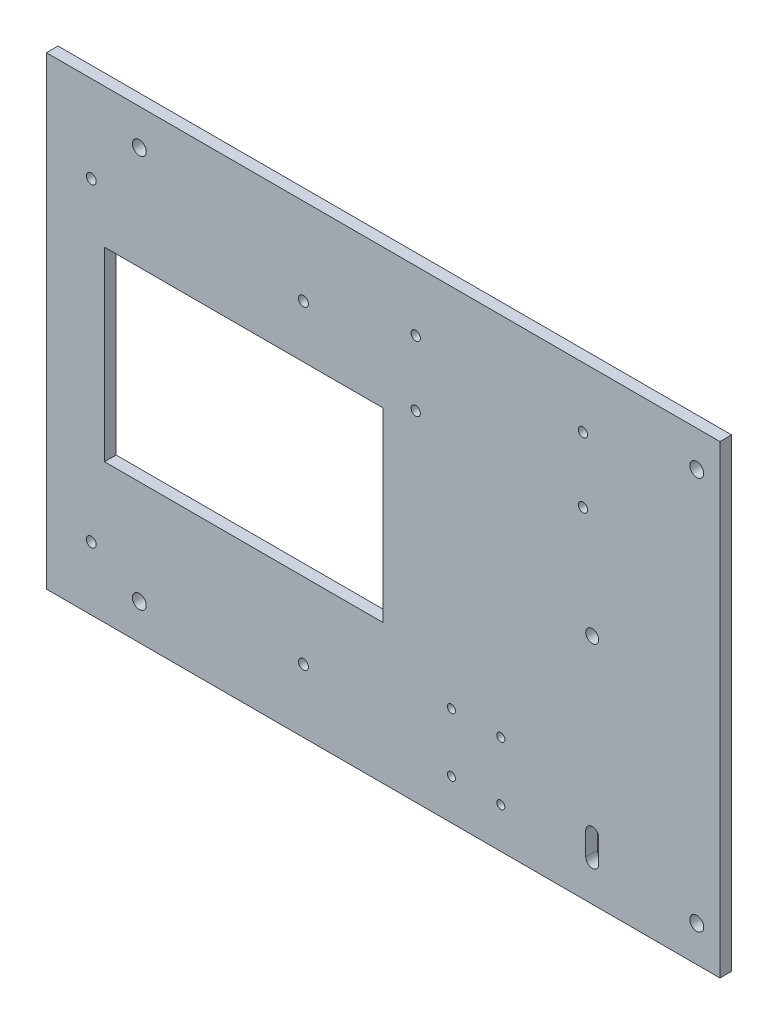
ISO-10303-21;
HEADER;
FILE_DESCRIPTION(('STEP AP214'),'2;1');
FILE_NAME('part.step','',(''),(''),'','','');
FILE_SCHEMA(('AUTOMOTIVE_DESIGN { 1 0 10303 214 1 1 1 1 }'));
ENDSEC;
DATA;
#1=APPLICATION_CONTEXT('core data for automotive mechanical design processes');
#2=APPLICATION_PROTOCOL_DEFINITION('international standard','automotive_design',2000,#1);
#3=PRODUCT_CONTEXT('',#1,'mechanical');
#4=PRODUCT('Part','Part','',(#3));
#5=PRODUCT_RELATED_PRODUCT_CATEGORY('part','',(#4));
#6=PRODUCT_DEFINITION_FORMATION('','',#4);
#7=PRODUCT_DEFINITION_CONTEXT('part definition',#1,'design');
#8=PRODUCT_DEFINITION('design','',#6,#7);
#9=PRODUCT_DEFINITION_SHAPE('','',#8);
#10=(LENGTH_UNIT() NAMED_UNIT(*) SI_UNIT(.MILLI.,.METRE.));
#11=(NAMED_UNIT(*) PLANE_ANGLE_UNIT() SI_UNIT($,.RADIAN.));
#12=(NAMED_UNIT(*) SI_UNIT($,.STERADIAN.) SOLID_ANGLE_UNIT());
#13=UNCERTAINTY_MEASURE_WITH_UNIT(LENGTH_MEASURE(1.E-05),#10,'distance_accuracy_value','');
#14=(GEOMETRIC_REPRESENTATION_CONTEXT(3) GLOBAL_UNCERTAINTY_ASSIGNED_CONTEXT((#13)) GLOBAL_UNIT_ASSIGNED_CONTEXT((#10,
#11,#12)) REPRESENTATION_CONTEXT('',''));
#15=CARTESIAN_POINT('',(0.,0.,0.));
#16=DIRECTION('',(0.,0.,1.));
#17=DIRECTION('',(1.,0.,0.));
#18=AXIS2_PLACEMENT_3D('',#15,#16,#17);
#19=CARTESIAN_POINT('',(92.075,63.5,3.175));
#20=DIRECTION('',(-1.,0.,0.));
#21=DIRECTION('',(0.,-1.,0.));
#22=AXIS2_PLACEMENT_3D('',#19,#20,#21);
#23=PLANE('',#22);
#24=DIRECTION('',(0.,1.,0.));
#25=VECTOR('',#24,1.);
#26=CARTESIAN_POINT('',(92.075,63.5,0.));
#27=LINE('',#26,#25);
#28=CARTESIAN_POINT('',(92.075,-63.5,0.));
#29=VERTEX_POINT('',#28);
#30=CARTESIAN_POINT('',(92.075,63.5,0.));
#31=VERTEX_POINT('',#30);
#32=EDGE_CURVE('E296',#29,#31,#27,.T.);
#33=ORIENTED_EDGE('',*,*,#32,.T.);
#34=DIRECTION('',(0.,0.,-1.));
#35=VECTOR('',#34,1.);
#36=CARTESIAN_POINT('',(92.075,63.5,3.175));
#37=LINE('',#36,#35);
#38=CARTESIAN_POINT('',(92.075,63.5,3.175));
#39=VERTEX_POINT('',#38);
#40=EDGE_CURVE('E11',#39,#31,#37,.T.);
#41=ORIENTED_EDGE('',*,*,#40,.F.);
#42=DIRECTION('',(0.,1.,0.));
#43=VECTOR('',#42,1.);
#44=CARTESIAN_POINT('',(92.075,63.5,3.175));
#45=LINE('',#44,#43);
#46=CARTESIAN_POINT('',(92.075,-63.5,3.175));
#47=VERTEX_POINT('',#46);
#48=EDGE_CURVE('E299',#47,#39,#45,.T.);
#49=ORIENTED_EDGE('',*,*,#48,.F.);
#50=DIRECTION('',(0.,0.,-1.));
#51=VECTOR('',#50,1.);
#52=CARTESIAN_POINT('',(92.075,-63.5,3.175));
#53=LINE('',#52,#51);
#54=EDGE_CURVE('E309',#47,#29,#53,.T.);
#55=ORIENTED_EDGE('',*,*,#54,.T.);
#56=EDGE_LOOP('',(#33,#41,#49,#55));
#57=FACE_BOUND('',#56,.T.);
#58=ADVANCED_FACE('F40',(#57),#23,.F.);
#59=CARTESIAN_POINT('',(-92.075,63.5,3.175));
#60=DIRECTION('',(0.,-1.,0.));
#61=DIRECTION('',(0.,0.,-1.));
#62=AXIS2_PLACEMENT_3D('',#59,#60,#61);
#63=PLANE('',#62);
#64=DIRECTION('',(-1.,0.,0.));
#65=VECTOR('',#64,1.);
#66=CARTESIAN_POINT('',(-92.075,63.5,0.));
#67=LINE('',#66,#65);
#68=CARTESIAN_POINT('',(-92.075,63.5,0.));
#69=VERTEX_POINT('',#68);
#70=EDGE_CURVE('E312',#31,#69,#67,.T.);
#71=ORIENTED_EDGE('',*,*,#70,.T.);
#72=DIRECTION('',(0.,0.,-1.));
#73=VECTOR('',#72,1.);
#74=CARTESIAN_POINT('',(-92.075,63.5,3.175));
#75=LINE('',#74,#73);
#76=CARTESIAN_POINT('',(-92.075,63.5,3.175));
#77=VERTEX_POINT('',#76);
#78=EDGE_CURVE('E47',#77,#69,#75,.T.);
#79=ORIENTED_EDGE('',*,*,#78,.F.);
#80=DIRECTION('',(-1.,0.,0.));
#81=VECTOR('',#80,1.);
#82=CARTESIAN_POINT('',(-92.075,63.5,3.175));
#83=LINE('',#82,#81);
#84=EDGE_CURVE('E302',#39,#77,#83,.T.);
#85=ORIENTED_EDGE('',*,*,#84,.F.);
#86=ORIENTED_EDGE('',*,*,#40,.T.);
#87=EDGE_LOOP('',(#71,#79,#85,#86));
#88=FACE_BOUND('',#87,.T.);
#89=ADVANCED_FACE('F341',(#88),#63,.F.);
#90=CARTESIAN_POINT('',(-92.075,63.5,3.175));
#91=DIRECTION('',(1.,0.,0.));
#92=DIRECTION('',(0.,1.,0.));
#93=AXIS2_PLACEMENT_3D('',#90,#91,#92);
#94=PLANE('',#93);
#95=DIRECTION('',(0.,-1.,0.));
#96=VECTOR('',#95,1.);
#97=CARTESIAN_POINT('',(-92.075,63.5,0.));
#98=LINE('',#97,#96);
#99=CARTESIAN_POINT('',(-92.075,-63.5,0.));
#100=VERTEX_POINT('',#99);
#101=EDGE_CURVE('E314',#69,#100,#98,.T.);
#102=ORIENTED_EDGE('',*,*,#101,.T.);
#103=DIRECTION('',(0.,0.,-1.));
#104=VECTOR('',#103,1.);
#105=CARTESIAN_POINT('',(-92.075,-63.5,3.175));
#106=LINE('',#105,#104);
#107=CARTESIAN_POINT('',(-92.075,-63.5,3.175));
#108=VERTEX_POINT('',#107);
#109=EDGE_CURVE('E319',#108,#100,#106,.T.);
#110=ORIENTED_EDGE('',*,*,#109,.F.);
#111=DIRECTION('',(0.,-1.,0.));
#112=VECTOR('',#111,1.);
#113=CARTESIAN_POINT('',(-92.075,63.5,3.175));
#114=LINE('',#113,#112);
#115=EDGE_CURVE('E305',#77,#108,#114,.T.);
#116=ORIENTED_EDGE('',*,*,#115,.F.);
#117=ORIENTED_EDGE('',*,*,#78,.T.);
#118=EDGE_LOOP('',(#102,#110,#116,#117));
#119=FACE_BOUND('',#118,.T.);
#120=ADVANCED_FACE('F326',(#119),#94,.F.);
#121=CARTESIAN_POINT('',(-92.075,-63.5,3.175));
#122=DIRECTION('',(0.,1.,0.));
#123=DIRECTION('',(0.,0.,1.));
#124=AXIS2_PLACEMENT_3D('',#121,#122,#123);
#125=PLANE('',#124);
#126=DIRECTION('',(1.,0.,0.));
#127=VECTOR('',#126,1.);
#128=CARTESIAN_POINT('',(-92.075,-63.5,0.));
#129=LINE('',#128,#127);
#130=EDGE_CURVE('E303',#100,#29,#129,.T.);
#131=ORIENTED_EDGE('',*,*,#130,.T.);
#132=ORIENTED_EDGE('',*,*,#54,.F.);
#133=DIRECTION('',(1.,0.,0.));
#134=VECTOR('',#133,1.);
#135=CARTESIAN_POINT('',(-92.075,-63.5,3.175));
#136=LINE('',#135,#134);
#137=EDGE_CURVE('E307',#108,#47,#136,.T.);
#138=ORIENTED_EDGE('',*,*,#137,.F.);
#139=ORIENTED_EDGE('',*,*,#109,.T.);
#140=EDGE_LOOP('',(#131,#132,#138,#139));
#141=FACE_BOUND('',#140,.T.);
#142=ADVANCED_FACE('F334',(#141),#125,.F.);
#143=CARTESIAN_POINT('',(0.,0.,3.175));
#144=DIRECTION('',(0.,0.,1.));
#145=DIRECTION('',(1.,0.,0.));
#146=AXIS2_PLACEMENT_3D('',#143,#144,#145);
#147=PLANE('',#146);
#148=DIRECTION('',(0.,1.,0.));
#149=VECTOR('',#148,1.);
#150=CARTESIAN_POINT('',(0.,25.4,3.175));
#151=LINE('',#150,#149);
#152=CARTESIAN_POINT('',(0.,-25.4,3.175));
#153=VERTEX_POINT('',#152);
#154=CARTESIAN_POINT('',(0.,25.4,3.175));
#155=VERTEX_POINT('',#154);
#156=EDGE_CURVE('E54',#153,#155,#151,.T.);
#157=ORIENTED_EDGE('',*,*,#156,.F.);
#158=DIRECTION('',(1.,0.,0.));
#159=VECTOR('',#158,1.);
#160=CARTESIAN_POINT('',(-76.2,-25.4,3.175));
#161=LINE('',#160,#159);
#162=CARTESIAN_POINT('',(-76.2,-25.4,3.175));
#163=VERTEX_POINT('',#162);
#164=EDGE_CURVE('E146',#163,#153,#161,.T.);
#165=ORIENTED_EDGE('',*,*,#164,.F.);
#166=DIRECTION('',(0.,-1.,0.));
#167=VECTOR('',#166,1.);
#168=CARTESIAN_POINT('',(-76.2,25.4,3.175));
#169=LINE('',#168,#167);
#170=CARTESIAN_POINT('',(-76.2,25.4,3.175));
#171=VERTEX_POINT('',#170);
#172=EDGE_CURVE('E149',#171,#163,#169,.T.);
#173=ORIENTED_EDGE('',*,*,#172,.F.);
#174=DIRECTION('',(-1.,0.,0.));
#175=VECTOR('',#174,1.);
#176=CARTESIAN_POINT('',(-76.2,25.4,3.175));
#177=LINE('',#176,#175);
#178=EDGE_CURVE('E155',#155,#171,#177,.T.);
#179=ORIENTED_EDGE('',*,*,#178,.F.);
#180=EDGE_LOOP('',(#157,#165,#173,#179));
#181=FACE_BOUND('',#180,.T.);
#182=CARTESIAN_POINT('',(57.15,0.,3.175));
#183=DIRECTION('',(0.,0.,1.));
#184=DIRECTION('',(1.,0.,0.));
#185=AXIS2_PLACEMENT_3D('',#182,#183,#184);
#186=CIRCLE('',#185,1.77800000000001);
#187=CARTESIAN_POINT('',(58.928,0.,3.175));
#188=VERTEX_POINT('',#187);
#189=EDGE_CURVE('E169',#188,#188,#186,.T.);
#190=ORIENTED_EDGE('',*,*,#189,.F.);
#191=EDGE_LOOP('',(#190));
#192=FACE_BOUND('',#191,.T.);
#193=CARTESIAN_POINT('',(57.15,-46.863,3.175));
#194=DIRECTION('',(0.,0.,1.));
#195=DIRECTION('',(1.,0.,0.));
#196=AXIS2_PLACEMENT_3D('',#193,#194,#195);
#197=CIRCLE('',#196,1.77800000000001);
#198=CARTESIAN_POINT('',(58.928,-46.863,3.175));
#199=VERTEX_POINT('',#198);
#200=CARTESIAN_POINT('',(55.372,-46.863,3.175));
#201=VERTEX_POINT('',#200);
#202=EDGE_CURVE('E161',#199,#201,#197,.T.);
#203=ORIENTED_EDGE('',*,*,#202,.F.);
#204=DIRECTION('',(0.,1.,0.));
#205=VECTOR('',#204,1.);
#206=CARTESIAN_POINT('',(58.928,-46.863,3.175));
#207=LINE('',#206,#205);
#208=CARTESIAN_POINT('',(58.928,-53.213,3.175));
#209=VERTEX_POINT('',#208);
#210=EDGE_CURVE('E177',#209,#199,#207,.T.);
#211=ORIENTED_EDGE('',*,*,#210,.F.);
#212=CARTESIAN_POINT('',(57.15,-53.213,3.175));
#213=DIRECTION('',(0.,0.,1.));
#214=DIRECTION('',(1.,0.,0.));
#215=AXIS2_PLACEMENT_3D('',#212,#213,#214);
#216=CIRCLE('',#215,1.77800000000001);
#217=CARTESIAN_POINT('',(55.372,-53.213,3.175));
#218=VERTEX_POINT('',#217);
#219=EDGE_CURVE('E191',#218,#209,#216,.T.);
#220=ORIENTED_EDGE('',*,*,#219,.F.);
#221=DIRECTION('',(0.,-1.,0.));
#222=VECTOR('',#221,1.);
#223=CARTESIAN_POINT('',(55.372,-46.863,3.175));
#224=LINE('',#223,#222);
#225=EDGE_CURVE('E188',#201,#218,#224,.T.);
#226=ORIENTED_EDGE('',*,*,#225,.F.);
#227=EDGE_LOOP('',(#203,#211,#220,#226));
#228=FACE_BOUND('',#227,.T.);
#229=CARTESIAN_POINT('',(8.89,46.99,3.175));
#230=DIRECTION('',(0.,0.,1.));
#231=DIRECTION('',(1.,0.,0.));
#232=AXIS2_PLACEMENT_3D('',#229,#230,#231);
#233=CIRCLE('',#232,1.27);
#234=CARTESIAN_POINT('',(10.16,46.99,3.175));
#235=VERTEX_POINT('',#234);
#236=EDGE_CURVE('E168',#235,#235,#233,.T.);
#237=ORIENTED_EDGE('',*,*,#236,.F.);
#238=EDGE_LOOP('',(#237));
#239=FACE_BOUND('',#238,.T.);
#240=CARTESIAN_POINT('',(8.89,29.21,3.175));
#241=DIRECTION('',(0.,0.,1.));
#242=DIRECTION('',(1.,0.,0.));
#243=AXIS2_PLACEMENT_3D('',#240,#241,#242);
#244=CIRCLE('',#243,1.27);
#245=CARTESIAN_POINT('',(10.16,29.21,3.175));
#246=VERTEX_POINT('',#245);
#247=EDGE_CURVE('E213',#246,#246,#244,.T.);
#248=ORIENTED_EDGE('',*,*,#247,.F.);
#249=EDGE_LOOP('',(#248));
#250=FACE_BOUND('',#249,.T.);
#251=CARTESIAN_POINT('',(54.61,29.21,3.175));
#252=DIRECTION('',(0.,0.,1.));
#253=DIRECTION('',(1.,0.,0.));
#254=AXIS2_PLACEMENT_3D('',#251,#252,#253);
#255=CIRCLE('',#254,1.27);
#256=CARTESIAN_POINT('',(55.88,29.21,3.175));
#257=VERTEX_POINT('',#256);
#258=EDGE_CURVE('E207',#257,#257,#255,.T.);
#259=ORIENTED_EDGE('',*,*,#258,.F.);
#260=EDGE_LOOP('',(#259));
#261=FACE_BOUND('',#260,.T.);
#262=CARTESIAN_POINT('',(54.61,46.99,3.175));
#263=DIRECTION('',(0.,0.,1.));
#264=DIRECTION('',(1.,0.,0.));
#265=AXIS2_PLACEMENT_3D('',#262,#263,#264);
#266=CIRCLE('',#265,1.27);
#267=CARTESIAN_POINT('',(55.88,46.99,3.175));
#268=VERTEX_POINT('',#267);
#269=EDGE_CURVE('E206',#268,#268,#266,.T.);
#270=ORIENTED_EDGE('',*,*,#269,.F.);
#271=EDGE_LOOP('',(#270));
#272=FACE_BOUND('',#271,.T.);
#273=CARTESIAN_POINT('',(18.650000038,-52.45,3.175));
#274=DIRECTION('',(0.,0.,1.));
#275=DIRECTION('',(1.,0.,0.));
#276=AXIS2_PLACEMENT_3D('',#273,#274,#275);
#277=CIRCLE('',#276,1.0999978);
#278=CARTESIAN_POINT('',(19.749997838,-52.45,3.175));
#279=VERTEX_POINT('',#278);
#280=EDGE_CURVE('E224',#279,#279,#277,.T.);
#281=ORIENTED_EDGE('',*,*,#280,.F.);
#282=EDGE_LOOP('',(#281));
#283=FACE_BOUND('',#282,.T.);
#284=CARTESIAN_POINT('',(32.149999962,-52.45,3.175));
#285=DIRECTION('',(0.,0.,1.));
#286=DIRECTION('',(1.,0.,0.));
#287=AXIS2_PLACEMENT_3D('',#284,#285,#286);
#288=CIRCLE('',#287,1.0999978);
#289=CARTESIAN_POINT('',(33.249997762,-52.45,3.175));
#290=VERTEX_POINT('',#289);
#291=EDGE_CURVE('E237',#290,#290,#288,.T.);
#292=ORIENTED_EDGE('',*,*,#291,.F.);
#293=EDGE_LOOP('',(#292));
#294=FACE_BOUND('',#293,.T.);
#295=CARTESIAN_POINT('',(32.149999962,-36.45,3.175));
#296=DIRECTION('',(0.,0.,1.));
#297=DIRECTION('',(1.,0.,0.));
#298=AXIS2_PLACEMENT_3D('',#295,#296,#297);
#299=CIRCLE('',#298,1.0999978);
#300=CARTESIAN_POINT('',(33.249997762,-36.45,3.175));
#301=VERTEX_POINT('',#300);
#302=EDGE_CURVE('E231',#301,#301,#299,.T.);
#303=ORIENTED_EDGE('',*,*,#302,.F.);
#304=EDGE_LOOP('',(#303));
#305=FACE_BOUND('',#304,.T.);
#306=CARTESIAN_POINT('',(18.650000038,-36.45,3.175));
#307=DIRECTION('',(0.,0.,1.));
#308=DIRECTION('',(1.,0.,0.));
#309=AXIS2_PLACEMENT_3D('',#306,#307,#308);
#310=CIRCLE('',#309,1.0999978);
#311=CARTESIAN_POINT('',(19.749997838,-36.45,3.175));
#312=VERTEX_POINT('',#311);
#313=EDGE_CURVE('E230',#312,#312,#310,.T.);
#314=ORIENTED_EDGE('',*,*,#313,.F.);
#315=EDGE_LOOP('',(#314));
#316=FACE_BOUND('',#315,.T.);
#317=CARTESIAN_POINT('',(-66.675,-53.721,3.175));
#318=DIRECTION('',(0.,0.,1.));
#319=DIRECTION('',(1.,0.,0.));
#320=AXIS2_PLACEMENT_3D('',#317,#318,#319);
#321=CIRCLE('',#320,1.89865);
#322=CARTESIAN_POINT('',(-64.77635,-53.721,3.175));
#323=VERTEX_POINT('',#322);
#324=EDGE_CURVE('E248',#323,#323,#321,.T.);
#325=ORIENTED_EDGE('',*,*,#324,.F.);
#326=EDGE_LOOP('',(#325));
#327=FACE_BOUND('',#326,.T.);
#328=CARTESIAN_POINT('',(85.725,-53.721,3.175));
#329=DIRECTION('',(0.,0.,1.));
#330=DIRECTION('',(1.,0.,0.));
#331=AXIS2_PLACEMENT_3D('',#328,#329,#330);
#332=CIRCLE('',#331,1.89865);
#333=CARTESIAN_POINT('',(87.62365,-53.721,3.175));
#334=VERTEX_POINT('',#333);
#335=EDGE_CURVE('E256',#334,#334,#332,.T.);
#336=ORIENTED_EDGE('',*,*,#335,.F.);
#337=EDGE_LOOP('',(#336));
#338=FACE_BOUND('',#337,.T.);
#339=CARTESIAN_POINT('',(-66.675,53.721,3.175));
#340=DIRECTION('',(0.,0.,1.));
#341=DIRECTION('',(1.,0.,0.));
#342=AXIS2_PLACEMENT_3D('',#339,#340,#341);
#343=CIRCLE('',#342,1.89865);
#344=CARTESIAN_POINT('',(-64.77635,53.721,3.175));
#345=VERTEX_POINT('',#344);
#346=EDGE_CURVE('E262',#345,#345,#343,.T.);
#347=ORIENTED_EDGE('',*,*,#346,.F.);
#348=EDGE_LOOP('',(#347));
#349=FACE_BOUND('',#348,.T.);
#350=CARTESIAN_POINT('',(85.725,53.721,3.175));
#351=DIRECTION('',(0.,0.,1.));
#352=DIRECTION('',(1.,0.,0.));
#353=AXIS2_PLACEMENT_3D('',#350,#351,#352);
#354=CIRCLE('',#353,1.89865);
#355=CARTESIAN_POINT('',(87.62365,53.721,3.175));
#356=VERTEX_POINT('',#355);
#357=EDGE_CURVE('E268',#356,#356,#354,.T.);
#358=ORIENTED_EDGE('',*,*,#357,.F.);
#359=EDGE_LOOP('',(#358));
#360=FACE_BOUND('',#359,.T.);
#361=CARTESIAN_POINT('',(-21.799999961,-46.175,3.175));
#362=DIRECTION('',(0.,0.,1.));
#363=DIRECTION('',(1.,0.,0.));
#364=AXIS2_PLACEMENT_3D('',#361,#362,#363);
#365=CIRCLE('',#364,1.35);
#366=CARTESIAN_POINT('',(-20.449999961,-46.175,3.175));
#367=VERTEX_POINT('',#366);
#368=EDGE_CURVE('E274',#367,#367,#365,.T.);
#369=ORIENTED_EDGE('',*,*,#368,.F.);
#370=EDGE_LOOP('',(#369));
#371=FACE_BOUND('',#370,.T.);
#372=CARTESIAN_POINT('',(-79.800000039,-46.175,3.175));
#373=DIRECTION('',(0.,0.,1.));
#374=DIRECTION('',(1.,0.,0.));
#375=AXIS2_PLACEMENT_3D('',#372,#373,#374);
#376=CIRCLE('',#375,1.35000000000001);
#377=CARTESIAN_POINT('',(-78.450000039,-46.175,3.175));
#378=VERTEX_POINT('',#377);
#379=EDGE_CURVE('E285',#378,#378,#376,.T.);
#380=ORIENTED_EDGE('',*,*,#379,.F.);
#381=EDGE_LOOP('',(#380));
#382=FACE_BOUND('',#381,.T.);
#383=CARTESIAN_POINT('',(-79.800000039,39.825,3.175));
#384=DIRECTION('',(0.,0.,1.));
#385=DIRECTION('',(1.,0.,0.));
#386=AXIS2_PLACEMENT_3D('',#383,#384,#385);
#387=CIRCLE('',#386,1.35000000000001);
#388=CARTESIAN_POINT('',(-78.450000039,39.825,3.175));
#389=VERTEX_POINT('',#388);
#390=EDGE_CURVE('E279',#389,#389,#387,.T.);
#391=ORIENTED_EDGE('',*,*,#390,.F.);
#392=EDGE_LOOP('',(#391));
#393=FACE_BOUND('',#392,.T.);
#394=CARTESIAN_POINT('',(-21.799999961,39.825,3.175));
#395=DIRECTION('',(0.,0.,1.));
#396=DIRECTION('',(1.,0.,0.));
#397=AXIS2_PLACEMENT_3D('',#394,#395,#396);
#398=CIRCLE('',#397,1.35);
#399=CARTESIAN_POINT('',(-20.449999961,39.825,3.175));
#400=VERTEX_POINT('',#399);
#401=EDGE_CURVE('E278',#400,#400,#398,.T.);
#402=ORIENTED_EDGE('',*,*,#401,.F.);
#403=EDGE_LOOP('',(#402));
#404=FACE_BOUND('',#403,.T.);
#405=ORIENTED_EDGE('',*,*,#48,.T.);
#406=ORIENTED_EDGE('',*,*,#84,.T.);
#407=ORIENTED_EDGE('',*,*,#115,.T.);
#408=ORIENTED_EDGE('',*,*,#137,.T.);
#409=EDGE_LOOP('',(#405,#406,#407,#408));
#410=FACE_BOUND('',#409,.T.);
#411=ADVANCED_FACE('F340',(#181,#192,#228,#239,#250,#261,#272,#283,#294,#305,#316,#327,#338,
#349,#360,#371,#382,#393,#404,#410),#147,.T.);
#412=CARTESIAN_POINT('',(0.,0.,0.));
#413=DIRECTION('',(0.,0.,1.));
#414=DIRECTION('',(1.,0.,0.));
#415=AXIS2_PLACEMENT_3D('',#412,#413,#414);
#416=PLANE('',#415);
#417=DIRECTION('',(1.,0.,0.));
#418=VECTOR('',#417,1.);
#419=CARTESIAN_POINT('',(-76.2,-25.4,0.));
#420=LINE('',#419,#418);
#421=CARTESIAN_POINT('',(-76.2,-25.4,0.));
#422=VERTEX_POINT('',#421);
#423=CARTESIAN_POINT('',(0.,-25.4,0.));
#424=VERTEX_POINT('',#423);
#425=EDGE_CURVE('E136',#422,#424,#420,.T.);
#426=ORIENTED_EDGE('',*,*,#425,.T.);
#427=DIRECTION('',(0.,1.,0.));
#428=VECTOR('',#427,1.);
#429=CARTESIAN_POINT('',(0.,25.4,0.));
#430=LINE('',#429,#428);
#431=CARTESIAN_POINT('',(0.,25.4,0.));
#432=VERTEX_POINT('',#431);
#433=EDGE_CURVE('E130',#424,#432,#430,.T.);
#434=ORIENTED_EDGE('',*,*,#433,.T.);
#435=DIRECTION('',(-1.,0.,0.));
#436=VECTOR('',#435,1.);
#437=CARTESIAN_POINT('',(-76.2,25.4,0.));
#438=LINE('',#437,#436);
#439=CARTESIAN_POINT('',(-76.2,25.4,0.));
#440=VERTEX_POINT('',#439);
#441=EDGE_CURVE('E139',#432,#440,#438,.T.);
#442=ORIENTED_EDGE('',*,*,#441,.T.);
#443=DIRECTION('',(0.,-1.,0.));
#444=VECTOR('',#443,1.);
#445=CARTESIAN_POINT('',(-76.2,25.4,0.));
#446=LINE('',#445,#444);
#447=EDGE_CURVE('E62',#440,#422,#446,.T.);
#448=ORIENTED_EDGE('',*,*,#447,.T.);
#449=EDGE_LOOP('',(#426,#434,#442,#448));
#450=FACE_BOUND('',#449,.T.);
#451=CARTESIAN_POINT('',(57.15,0.,0.));
#452=DIRECTION('',(0.,0.,1.));
#453=DIRECTION('',(1.,0.,0.));
#454=AXIS2_PLACEMENT_3D('',#451,#452,#453);
#455=CIRCLE('',#454,1.77800000000001);
#456=CARTESIAN_POINT('',(58.928,0.,0.));
#457=VERTEX_POINT('',#456);
#458=EDGE_CURVE('E165',#457,#457,#455,.T.);
#459=ORIENTED_EDGE('',*,*,#458,.T.);
#460=EDGE_LOOP('',(#459));
#461=FACE_BOUND('',#460,.T.);
#462=DIRECTION('',(0.,1.,0.));
#463=VECTOR('',#462,1.);
#464=CARTESIAN_POINT('',(58.928,-46.863,0.));
#465=LINE('',#464,#463);
#466=CARTESIAN_POINT('',(58.928,-53.213,0.));
#467=VERTEX_POINT('',#466);
#468=CARTESIAN_POINT('',(58.928,-46.863,0.));
#469=VERTEX_POINT('',#468);
#470=EDGE_CURVE('E183',#467,#469,#465,.T.);
#471=ORIENTED_EDGE('',*,*,#470,.T.);
#472=CARTESIAN_POINT('',(57.15,-46.863,0.));
#473=DIRECTION('',(0.,0.,1.));
#474=DIRECTION('',(1.,0.,0.));
#475=AXIS2_PLACEMENT_3D('',#472,#473,#474);
#476=CIRCLE('',#475,1.77800000000001);
#477=CARTESIAN_POINT('',(55.372,-46.863,0.));
#478=VERTEX_POINT('',#477);
#479=EDGE_CURVE('E173',#469,#478,#476,.T.);
#480=ORIENTED_EDGE('',*,*,#479,.T.);
#481=DIRECTION('',(0.,-1.,0.));
#482=VECTOR('',#481,1.);
#483=CARTESIAN_POINT('',(55.372,-46.863,0.));
#484=LINE('',#483,#482);
#485=CARTESIAN_POINT('',(55.372,-53.213,0.));
#486=VERTEX_POINT('',#485);
#487=EDGE_CURVE('E176',#478,#486,#484,.T.);
#488=ORIENTED_EDGE('',*,*,#487,.T.);
#489=CARTESIAN_POINT('',(57.15,-53.213,0.));
#490=DIRECTION('',(0.,0.,1.));
#491=DIRECTION('',(1.,0.,0.));
#492=AXIS2_PLACEMENT_3D('',#489,#490,#491);
#493=CIRCLE('',#492,1.77800000000001);
#494=EDGE_CURVE('E180',#486,#467,#493,.T.);
#495=ORIENTED_EDGE('',*,*,#494,.T.);
#496=EDGE_LOOP('',(#471,#480,#488,#495));
#497=FACE_BOUND('',#496,.T.);
#498=CARTESIAN_POINT('',(8.89,46.99,0.));
#499=DIRECTION('',(0.,0.,1.));
#500=DIRECTION('',(1.,0.,0.));
#501=AXIS2_PLACEMENT_3D('',#498,#499,#500);
#502=CIRCLE('',#501,1.27);
#503=CARTESIAN_POINT('',(10.16,46.99,0.));
#504=VERTEX_POINT('',#503);
#505=EDGE_CURVE('E216',#504,#504,#502,.T.);
#506=ORIENTED_EDGE('',*,*,#505,.T.);
#507=EDGE_LOOP('',(#506));
#508=FACE_BOUND('',#507,.T.);
#509=CARTESIAN_POINT('',(8.89,29.21,0.));
#510=DIRECTION('',(0.,0.,1.));
#511=DIRECTION('',(1.,0.,0.));
#512=AXIS2_PLACEMENT_3D('',#509,#510,#511);
#513=CIRCLE('',#512,1.27);
#514=CARTESIAN_POINT('',(10.16,29.21,0.));
#515=VERTEX_POINT('',#514);
#516=EDGE_CURVE('E210',#515,#515,#513,.T.);
#517=ORIENTED_EDGE('',*,*,#516,.T.);
#518=EDGE_LOOP('',(#517));
#519=FACE_BOUND('',#518,.T.);
#520=CARTESIAN_POINT('',(54.61,29.21,0.));
#521=DIRECTION('',(0.,0.,1.));
#522=DIRECTION('',(1.,0.,0.));
#523=AXIS2_PLACEMENT_3D('',#520,#521,#522);
#524=CIRCLE('',#523,1.27);
#525=CARTESIAN_POINT('',(55.88,29.21,0.));
#526=VERTEX_POINT('',#525);
#527=EDGE_CURVE('E203',#526,#526,#524,.T.);
#528=ORIENTED_EDGE('',*,*,#527,.T.);
#529=EDGE_LOOP('',(#528));
#530=FACE_BOUND('',#529,.T.);
#531=CARTESIAN_POINT('',(54.61,46.99,0.));
#532=DIRECTION('',(0.,0.,1.));
#533=DIRECTION('',(1.,0.,0.));
#534=AXIS2_PLACEMENT_3D('',#531,#532,#533);
#535=CIRCLE('',#534,1.27);
#536=CARTESIAN_POINT('',(55.88,46.99,0.));
#537=VERTEX_POINT('',#536);
#538=EDGE_CURVE('E221',#537,#537,#535,.T.);
#539=ORIENTED_EDGE('',*,*,#538,.T.);
#540=EDGE_LOOP('',(#539));
#541=FACE_BOUND('',#540,.T.);
#542=CARTESIAN_POINT('',(18.650000038,-52.45,0.));
#543=DIRECTION('',(0.,0.,1.));
#544=DIRECTION('',(1.,0.,0.));
#545=AXIS2_PLACEMENT_3D('',#542,#543,#544);
#546=CIRCLE('',#545,1.0999978);
#547=CARTESIAN_POINT('',(19.749997838,-52.45,0.));
#548=VERTEX_POINT('',#547);
#549=EDGE_CURVE('E240',#548,#548,#546,.T.);
#550=ORIENTED_EDGE('',*,*,#549,.T.);
#551=EDGE_LOOP('',(#550));
#552=FACE_BOUND('',#551,.T.);
#553=CARTESIAN_POINT('',(32.149999962,-52.45,0.));
#554=DIRECTION('',(0.,0.,1.));
#555=DIRECTION('',(1.,0.,0.));
#556=AXIS2_PLACEMENT_3D('',#553,#554,#555);
#557=CIRCLE('',#556,1.0999978);
#558=CARTESIAN_POINT('',(33.249997762,-52.45,0.));
#559=VERTEX_POINT('',#558);
#560=EDGE_CURVE('E234',#559,#559,#557,.T.);
#561=ORIENTED_EDGE('',*,*,#560,.T.);
#562=EDGE_LOOP('',(#561));
#563=FACE_BOUND('',#562,.T.);
#564=CARTESIAN_POINT('',(32.149999962,-36.45,0.));
#565=DIRECTION('',(0.,0.,1.));
#566=DIRECTION('',(1.,0.,0.));
#567=AXIS2_PLACEMENT_3D('',#564,#565,#566);
#568=CIRCLE('',#567,1.0999978);
#569=CARTESIAN_POINT('',(33.249997762,-36.45,0.));
#570=VERTEX_POINT('',#569);
#571=EDGE_CURVE('E227',#570,#570,#568,.T.);
#572=ORIENTED_EDGE('',*,*,#571,.T.);
#573=EDGE_LOOP('',(#572));
#574=FACE_BOUND('',#573,.T.);
#575=CARTESIAN_POINT('',(18.650000038,-36.45,0.));
#576=DIRECTION('',(0.,0.,1.));
#577=DIRECTION('',(1.,0.,0.));
#578=AXIS2_PLACEMENT_3D('',#575,#576,#577);
#579=CIRCLE('',#578,1.0999978);
#580=CARTESIAN_POINT('',(19.749997838,-36.45,0.));
#581=VERTEX_POINT('',#580);
#582=EDGE_CURVE('E245',#581,#581,#579,.T.);
#583=ORIENTED_EDGE('',*,*,#582,.T.);
#584=EDGE_LOOP('',(#583));
#585=FACE_BOUND('',#584,.T.);
#586=CARTESIAN_POINT('',(-66.675,-53.721,0.));
#587=DIRECTION('',(0.,0.,1.));
#588=DIRECTION('',(1.,0.,0.));
#589=AXIS2_PLACEMENT_3D('',#586,#587,#588);
#590=CIRCLE('',#589,1.89865);
#591=CARTESIAN_POINT('',(-64.77635,-53.721,0.));
#592=VERTEX_POINT('',#591);
#593=EDGE_CURVE('E253',#592,#592,#590,.T.);
#594=ORIENTED_EDGE('',*,*,#593,.T.);
#595=EDGE_LOOP('',(#594));
#596=FACE_BOUND('',#595,.T.);
#597=CARTESIAN_POINT('',(85.725,-53.721,0.));
#598=DIRECTION('',(0.,0.,1.));
#599=DIRECTION('',(1.,0.,0.));
#600=AXIS2_PLACEMENT_3D('',#597,#598,#599);
#601=CIRCLE('',#600,1.89865);
#602=CARTESIAN_POINT('',(87.62365,-53.721,0.));
#603=VERTEX_POINT('',#602);
#604=EDGE_CURVE('E259',#603,#603,#601,.T.);
#605=ORIENTED_EDGE('',*,*,#604,.T.);
#606=EDGE_LOOP('',(#605));
#607=FACE_BOUND('',#606,.T.);
#608=CARTESIAN_POINT('',(-66.675,53.721,0.));
#609=DIRECTION('',(0.,0.,1.));
#610=DIRECTION('',(1.,0.,0.));
#611=AXIS2_PLACEMENT_3D('',#608,#609,#610);
#612=CIRCLE('',#611,1.89865);
#613=CARTESIAN_POINT('',(-64.77635,53.721,0.));
#614=VERTEX_POINT('',#613);
#615=EDGE_CURVE('E265',#614,#614,#612,.T.);
#616=ORIENTED_EDGE('',*,*,#615,.T.);
#617=EDGE_LOOP('',(#616));
#618=FACE_BOUND('',#617,.T.);
#619=CARTESIAN_POINT('',(85.725,53.721,0.));
#620=DIRECTION('',(0.,0.,1.));
#621=DIRECTION('',(1.,0.,0.));
#622=AXIS2_PLACEMENT_3D('',#619,#620,#621);
#623=CIRCLE('',#622,1.89865);
#624=CARTESIAN_POINT('',(87.62365,53.721,0.));
#625=VERTEX_POINT('',#624);
#626=EDGE_CURVE('E271',#625,#625,#623,.T.);
#627=ORIENTED_EDGE('',*,*,#626,.T.);
#628=EDGE_LOOP('',(#627));
#629=FACE_BOUND('',#628,.T.);
#630=CARTESIAN_POINT('',(-21.799999961,-46.175,0.));
#631=DIRECTION('',(0.,0.,1.));
#632=DIRECTION('',(1.,0.,0.));
#633=AXIS2_PLACEMENT_3D('',#630,#631,#632);
#634=CIRCLE('',#633,1.35);
#635=CARTESIAN_POINT('',(-20.449999961,-46.175,0.));
#636=VERTEX_POINT('',#635);
#637=EDGE_CURVE('E288',#636,#636,#634,.T.);
#638=ORIENTED_EDGE('',*,*,#637,.T.);
#639=EDGE_LOOP('',(#638));
#640=FACE_BOUND('',#639,.T.);
#641=CARTESIAN_POINT('',(-79.800000039,-46.175,0.));
#642=DIRECTION('',(0.,0.,1.));
#643=DIRECTION('',(1.,0.,0.));
#644=AXIS2_PLACEMENT_3D('',#641,#642,#643);
#645=CIRCLE('',#644,1.35000000000001);
#646=CARTESIAN_POINT('',(-78.450000039,-46.175,0.));
#647=VERTEX_POINT('',#646);
#648=EDGE_CURVE('E282',#647,#647,#645,.T.);
#649=ORIENTED_EDGE('',*,*,#648,.T.);
#650=EDGE_LOOP('',(#649));
#651=FACE_BOUND('',#650,.T.);
#652=CARTESIAN_POINT('',(-79.800000039,39.825,0.));
#653=DIRECTION('',(0.,0.,1.));
#654=DIRECTION('',(1.,0.,0.));
#655=AXIS2_PLACEMENT_3D('',#652,#653,#654);
#656=CIRCLE('',#655,1.35000000000001);
#657=CARTESIAN_POINT('',(-78.450000039,39.825,0.));
#658=VERTEX_POINT('',#657);
#659=EDGE_CURVE('E275',#658,#658,#656,.T.);
#660=ORIENTED_EDGE('',*,*,#659,.T.);
#661=EDGE_LOOP('',(#660));
#662=FACE_BOUND('',#661,.T.);
#663=CARTESIAN_POINT('',(-21.799999961,39.825,0.));
#664=DIRECTION('',(0.,0.,1.));
#665=DIRECTION('',(1.,0.,0.));
#666=AXIS2_PLACEMENT_3D('',#663,#664,#665);
#667=CIRCLE('',#666,1.35);
#668=CARTESIAN_POINT('',(-20.449999961,39.825,0.));
#669=VERTEX_POINT('',#668);
#670=EDGE_CURVE('E293',#669,#669,#667,.T.);
#671=ORIENTED_EDGE('',*,*,#670,.T.);
#672=EDGE_LOOP('',(#671));
#673=FACE_BOUND('',#672,.T.);
#674=ORIENTED_EDGE('',*,*,#32,.F.);
#675=ORIENTED_EDGE('',*,*,#130,.F.);
#676=ORIENTED_EDGE('',*,*,#101,.F.);
#677=ORIENTED_EDGE('',*,*,#70,.F.);
#678=EDGE_LOOP('',(#674,#675,#676,#677));
#679=FACE_BOUND('',#678,.T.);
#680=ADVANCED_FACE('F143',(#450,#461,#497,#508,#519,#530,#541,#552,#563,#574,#585,#596,#607,
#618,#629,#640,#651,#662,#673,#679),#416,.F.);
#681=CARTESIAN_POINT('',(-21.799999961,39.825,0.));
#682=DIRECTION('',(0.,0.,1.));
#683=DIRECTION('',(1.,0.,0.));
#684=AXIS2_PLACEMENT_3D('',#681,#682,#683);
#685=CYLINDRICAL_SURFACE('',#684,1.35);
#686=ORIENTED_EDGE('',*,*,#670,.F.);
#687=EDGE_LOOP('',(#686));
#688=FACE_BOUND('',#687,.T.);
#689=ORIENTED_EDGE('',*,*,#401,.T.);
#690=EDGE_LOOP('',(#689));
#691=FACE_BOUND('',#690,.T.);
#692=ADVANCED_FACE('F353',(#688,#691),#685,.F.);
#693=CARTESIAN_POINT('',(-79.800000039,39.825,0.));
#694=DIRECTION('',(0.,0.,1.));
#695=DIRECTION('',(1.,0.,0.));
#696=AXIS2_PLACEMENT_3D('',#693,#694,#695);
#697=CYLINDRICAL_SURFACE('',#696,1.35000000000001);
#698=ORIENTED_EDGE('',*,*,#659,.F.);
#699=EDGE_LOOP('',(#698));
#700=FACE_BOUND('',#699,.T.);
#701=ORIENTED_EDGE('',*,*,#390,.T.);
#702=EDGE_LOOP('',(#701));
#703=FACE_BOUND('',#702,.T.);
#704=ADVANCED_FACE('F359',(#700,#703),#697,.F.);
#705=CARTESIAN_POINT('',(-79.800000039,-46.175,0.));
#706=DIRECTION('',(0.,0.,1.));
#707=DIRECTION('',(1.,0.,0.));
#708=AXIS2_PLACEMENT_3D('',#705,#706,#707);
#709=CYLINDRICAL_SURFACE('',#708,1.35000000000001);
#710=ORIENTED_EDGE('',*,*,#648,.F.);
#711=EDGE_LOOP('',(#710));
#712=FACE_BOUND('',#711,.T.);
#713=ORIENTED_EDGE('',*,*,#379,.T.);
#714=EDGE_LOOP('',(#713));
#715=FACE_BOUND('',#714,.T.);
#716=ADVANCED_FACE('F365',(#712,#715),#709,.F.);
#717=CARTESIAN_POINT('',(-21.799999961,-46.175,0.));
#718=DIRECTION('',(0.,0.,1.));
#719=DIRECTION('',(1.,0.,0.));
#720=AXIS2_PLACEMENT_3D('',#717,#718,#719);
#721=CYLINDRICAL_SURFACE('',#720,1.35);
#722=ORIENTED_EDGE('',*,*,#637,.F.);
#723=EDGE_LOOP('',(#722));
#724=FACE_BOUND('',#723,.T.);
#725=ORIENTED_EDGE('',*,*,#368,.T.);
#726=EDGE_LOOP('',(#725));
#727=FACE_BOUND('',#726,.T.);
#728=ADVANCED_FACE('F361',(#724,#727),#721,.F.);
#729=CARTESIAN_POINT('',(85.725,53.721,3.175));
#730=DIRECTION('',(0.,0.,1.));
#731=DIRECTION('',(1.,0.,0.));
#732=AXIS2_PLACEMENT_3D('',#729,#730,#731);
#733=CYLINDRICAL_SURFACE('',#732,1.89865);
#734=ORIENTED_EDGE('',*,*,#626,.F.);
#735=EDGE_LOOP('',(#734));
#736=FACE_BOUND('',#735,.T.);
#737=ORIENTED_EDGE('',*,*,#357,.T.);
#738=EDGE_LOOP('',(#737));
#739=FACE_BOUND('',#738,.T.);
#740=ADVANCED_FACE('F364',(#736,#739),#733,.F.);
#741=CARTESIAN_POINT('',(-66.675,53.721,3.175));
#742=DIRECTION('',(0.,0.,1.));
#743=DIRECTION('',(1.,0.,0.));
#744=AXIS2_PLACEMENT_3D('',#741,#742,#743);
#745=CYLINDRICAL_SURFACE('',#744,1.89865);
#746=ORIENTED_EDGE('',*,*,#615,.F.);
#747=EDGE_LOOP('',(#746));
#748=FACE_BOUND('',#747,.T.);
#749=ORIENTED_EDGE('',*,*,#346,.T.);
#750=EDGE_LOOP('',(#749));
#751=FACE_BOUND('',#750,.T.);
#752=ADVANCED_FACE('F375',(#748,#751),#745,.F.);
#753=CARTESIAN_POINT('',(85.725,-53.721,3.175));
#754=DIRECTION('',(0.,0.,1.));
#755=DIRECTION('',(1.,0.,0.));
#756=AXIS2_PLACEMENT_3D('',#753,#754,#755);
#757=CYLINDRICAL_SURFACE('',#756,1.89865);
#758=ORIENTED_EDGE('',*,*,#604,.F.);
#759=EDGE_LOOP('',(#758));
#760=FACE_BOUND('',#759,.T.);
#761=ORIENTED_EDGE('',*,*,#335,.T.);
#762=EDGE_LOOP('',(#761));
#763=FACE_BOUND('',#762,.T.);
#764=ADVANCED_FACE('F379',(#760,#763),#757,.F.);
#765=CARTESIAN_POINT('',(-66.675,-53.721,3.175));
#766=DIRECTION('',(0.,0.,1.));
#767=DIRECTION('',(1.,0.,0.));
#768=AXIS2_PLACEMENT_3D('',#765,#766,#767);
#769=CYLINDRICAL_SURFACE('',#768,1.89865);
#770=ORIENTED_EDGE('',*,*,#593,.F.);
#771=EDGE_LOOP('',(#770));
#772=FACE_BOUND('',#771,.T.);
#773=ORIENTED_EDGE('',*,*,#324,.T.);
#774=EDGE_LOOP('',(#773));
#775=FACE_BOUND('',#774,.T.);
#776=ADVANCED_FACE('F383',(#772,#775),#769,.F.);
#777=CARTESIAN_POINT('',(18.650000038,-36.45,0.));
#778=DIRECTION('',(0.,0.,1.));
#779=DIRECTION('',(1.,0.,0.));
#780=AXIS2_PLACEMENT_3D('',#777,#778,#779);
#781=CYLINDRICAL_SURFACE('',#780,1.0999978);
#782=ORIENTED_EDGE('',*,*,#582,.F.);
#783=EDGE_LOOP('',(#782));
#784=FACE_BOUND('',#783,.T.);
#785=ORIENTED_EDGE('',*,*,#313,.T.);
#786=EDGE_LOOP('',(#785));
#787=FACE_BOUND('',#786,.T.);
#788=ADVANCED_FACE('F387',(#784,#787),#781,.F.);
#789=CARTESIAN_POINT('',(32.149999962,-36.45,0.));
#790=DIRECTION('',(0.,0.,1.));
#791=DIRECTION('',(1.,0.,0.));
#792=AXIS2_PLACEMENT_3D('',#789,#790,#791);
#793=CYLINDRICAL_SURFACE('',#792,1.0999978);
#794=ORIENTED_EDGE('',*,*,#571,.F.);
#795=EDGE_LOOP('',(#794));
#796=FACE_BOUND('',#795,.T.);
#797=ORIENTED_EDGE('',*,*,#302,.T.);
#798=EDGE_LOOP('',(#797));
#799=FACE_BOUND('',#798,.T.);
#800=ADVANCED_FACE('F391',(#796,#799),#793,.F.);
#801=CARTESIAN_POINT('',(32.149999962,-52.45,0.));
#802=DIRECTION('',(0.,0.,1.));
#803=DIRECTION('',(1.,0.,0.));
#804=AXIS2_PLACEMENT_3D('',#801,#802,#803);
#805=CYLINDRICAL_SURFACE('',#804,1.0999978);
#806=ORIENTED_EDGE('',*,*,#560,.F.);
#807=EDGE_LOOP('',(#806));
#808=FACE_BOUND('',#807,.T.);
#809=ORIENTED_EDGE('',*,*,#291,.T.);
#810=EDGE_LOOP('',(#809));
#811=FACE_BOUND('',#810,.T.);
#812=ADVANCED_FACE('F397',(#808,#811),#805,.F.);
#813=CARTESIAN_POINT('',(18.650000038,-52.45,0.));
#814=DIRECTION('',(0.,0.,1.));
#815=DIRECTION('',(1.,0.,0.));
#816=AXIS2_PLACEMENT_3D('',#813,#814,#815);
#817=CYLINDRICAL_SURFACE('',#816,1.0999978);
#818=ORIENTED_EDGE('',*,*,#549,.F.);
#819=EDGE_LOOP('',(#818));
#820=FACE_BOUND('',#819,.T.);
#821=ORIENTED_EDGE('',*,*,#280,.T.);
#822=EDGE_LOOP('',(#821));
#823=FACE_BOUND('',#822,.T.);
#824=ADVANCED_FACE('F393',(#820,#823),#817,.F.);
#825=CARTESIAN_POINT('',(54.61,46.99,0.));
#826=DIRECTION('',(0.,0.,1.));
#827=DIRECTION('',(1.,0.,0.));
#828=AXIS2_PLACEMENT_3D('',#825,#826,#827);
#829=CYLINDRICAL_SURFACE('',#828,1.27);
#830=ORIENTED_EDGE('',*,*,#538,.F.);
#831=EDGE_LOOP('',(#830));
#832=FACE_BOUND('',#831,.T.);
#833=ORIENTED_EDGE('',*,*,#269,.T.);
#834=EDGE_LOOP('',(#833));
#835=FACE_BOUND('',#834,.T.);
#836=ADVANCED_FACE('F396',(#832,#835),#829,.F.);
#837=CARTESIAN_POINT('',(54.61,29.21,0.));
#838=DIRECTION('',(0.,0.,1.));
#839=DIRECTION('',(1.,0.,0.));
#840=AXIS2_PLACEMENT_3D('',#837,#838,#839);
#841=CYLINDRICAL_SURFACE('',#840,1.27);
#842=ORIENTED_EDGE('',*,*,#527,.F.);
#843=EDGE_LOOP('',(#842));
#844=FACE_BOUND('',#843,.T.);
#845=ORIENTED_EDGE('',*,*,#258,.T.);
#846=EDGE_LOOP('',(#845));
#847=FACE_BOUND('',#846,.T.);
#848=ADVANCED_FACE('F407',(#844,#847),#841,.F.);
#849=CARTESIAN_POINT('',(8.89,29.21,0.));
#850=DIRECTION('',(0.,0.,1.));
#851=DIRECTION('',(1.,0.,0.));
#852=AXIS2_PLACEMENT_3D('',#849,#850,#851);
#853=CYLINDRICAL_SURFACE('',#852,1.27);
#854=ORIENTED_EDGE('',*,*,#516,.F.);
#855=EDGE_LOOP('',(#854));
#856=FACE_BOUND('',#855,.T.);
#857=ORIENTED_EDGE('',*,*,#247,.T.);
#858=EDGE_LOOP('',(#857));
#859=FACE_BOUND('',#858,.T.);
#860=ADVANCED_FACE('F413',(#856,#859),#853,.F.);
#861=CARTESIAN_POINT('',(8.89,46.99,0.));
#862=DIRECTION('',(0.,0.,1.));
#863=DIRECTION('',(1.,0.,0.));
#864=AXIS2_PLACEMENT_3D('',#861,#862,#863);
#865=CYLINDRICAL_SURFACE('',#864,1.27);
#866=ORIENTED_EDGE('',*,*,#505,.F.);
#867=EDGE_LOOP('',(#866));
#868=FACE_BOUND('',#867,.T.);
#869=ORIENTED_EDGE('',*,*,#236,.T.);
#870=EDGE_LOOP('',(#869));
#871=FACE_BOUND('',#870,.T.);
#872=ADVANCED_FACE('F409',(#868,#871),#865,.F.);
#873=CARTESIAN_POINT('',(57.15,-46.863,0.));
#874=DIRECTION('',(0.,0.,1.));
#875=DIRECTION('',(1.,0.,0.));
#876=AXIS2_PLACEMENT_3D('',#873,#874,#875);
#877=CYLINDRICAL_SURFACE('',#876,1.77800000000001);
#878=ORIENTED_EDGE('',*,*,#202,.T.);
#879=DIRECTION('',(0.,0.,1.));
#880=VECTOR('',#879,1.);
#881=CARTESIAN_POINT('',(55.372,-46.863,0.));
#882=LINE('',#881,#880);
#883=EDGE_CURVE('E186',#478,#201,#882,.T.);
#884=ORIENTED_EDGE('',*,*,#883,.F.);
#885=ORIENTED_EDGE('',*,*,#479,.F.);
#886=DIRECTION('',(0.,0.,1.));
#887=VECTOR('',#886,1.);
#888=CARTESIAN_POINT('',(58.928,-46.863,0.));
#889=LINE('',#888,#887);
#890=EDGE_CURVE('E172',#469,#199,#889,.T.);
#891=ORIENTED_EDGE('',*,*,#890,.T.);
#892=EDGE_LOOP('',(#878,#884,#885,#891));
#893=FACE_BOUND('',#892,.T.);
#894=ADVANCED_FACE('F412',(#893),#877,.F.);
#895=CARTESIAN_POINT('',(58.928,-46.863,0.));
#896=DIRECTION('',(1.,0.,0.));
#897=DIRECTION('',(0.,0.,-1.));
#898=AXIS2_PLACEMENT_3D('',#895,#896,#897);
#899=PLANE('',#898);
#900=ORIENTED_EDGE('',*,*,#210,.T.);
#901=ORIENTED_EDGE('',*,*,#890,.F.);
#902=ORIENTED_EDGE('',*,*,#470,.F.);
#903=DIRECTION('',(0.,0.,1.));
#904=VECTOR('',#903,1.);
#905=CARTESIAN_POINT('',(58.928,-53.213,0.));
#906=LINE('',#905,#904);
#907=EDGE_CURVE('E197',#467,#209,#906,.T.);
#908=ORIENTED_EDGE('',*,*,#907,.T.);
#909=EDGE_LOOP('',(#900,#901,#902,#908));
#910=FACE_BOUND('',#909,.T.);
#911=ADVANCED_FACE('F423',(#910),#899,.F.);
#912=CARTESIAN_POINT('',(57.15,-53.213,0.));
#913=DIRECTION('',(0.,0.,1.));
#914=DIRECTION('',(1.,0.,0.));
#915=AXIS2_PLACEMENT_3D('',#912,#913,#914);
#916=CYLINDRICAL_SURFACE('',#915,1.77800000000001);
#917=ORIENTED_EDGE('',*,*,#219,.T.);
#918=ORIENTED_EDGE('',*,*,#907,.F.);
#919=ORIENTED_EDGE('',*,*,#494,.F.);
#920=DIRECTION('',(0.,0.,1.));
#921=VECTOR('',#920,1.);
#922=CARTESIAN_POINT('',(55.372,-53.213,0.));
#923=LINE('',#922,#921);
#924=EDGE_CURVE('E199',#486,#218,#923,.T.);
#925=ORIENTED_EDGE('',*,*,#924,.T.);
#926=EDGE_LOOP('',(#917,#918,#919,#925));
#927=FACE_BOUND('',#926,.T.);
#928=ADVANCED_FACE('F429',(#927),#916,.F.);
#929=CARTESIAN_POINT('',(55.372,-46.863,0.));
#930=DIRECTION('',(-1.,0.,0.));
#931=DIRECTION('',(0.,0.,1.));
#932=AXIS2_PLACEMENT_3D('',#929,#930,#931);
#933=PLANE('',#932);
#934=ORIENTED_EDGE('',*,*,#225,.T.);
#935=ORIENTED_EDGE('',*,*,#924,.F.);
#936=ORIENTED_EDGE('',*,*,#487,.F.);
#937=ORIENTED_EDGE('',*,*,#883,.T.);
#938=EDGE_LOOP('',(#934,#935,#936,#937));
#939=FACE_BOUND('',#938,.T.);
#940=ADVANCED_FACE('F425',(#939),#933,.F.);
#941=CARTESIAN_POINT('',(57.15,0.,0.));
#942=DIRECTION('',(0.,0.,1.));
#943=DIRECTION('',(1.,0.,0.));
#944=AXIS2_PLACEMENT_3D('',#941,#942,#943);
#945=CYLINDRICAL_SURFACE('',#944,1.77800000000001);
#946=ORIENTED_EDGE('',*,*,#458,.F.);
#947=EDGE_LOOP('',(#946));
#948=FACE_BOUND('',#947,.T.);
#949=ORIENTED_EDGE('',*,*,#189,.T.);
#950=EDGE_LOOP('',(#949));
#951=FACE_BOUND('',#950,.T.);
#952=ADVANCED_FACE('F428',(#948,#951),#945,.F.);
#953=CARTESIAN_POINT('',(0.,25.4,0.));
#954=DIRECTION('',(1.,0.,0.));
#955=DIRECTION('',(0.,0.,-1.));
#956=AXIS2_PLACEMENT_3D('',#953,#954,#955);
#957=PLANE('',#956);
#958=ORIENTED_EDGE('',*,*,#156,.T.);
#959=DIRECTION('',(0.,0.,1.));
#960=VECTOR('',#959,1.);
#961=CARTESIAN_POINT('',(0.,25.4,0.));
#962=LINE('',#961,#960);
#963=EDGE_CURVE('E126',#432,#155,#962,.T.);
#964=ORIENTED_EDGE('',*,*,#963,.F.);
#965=ORIENTED_EDGE('',*,*,#433,.F.);
#966=DIRECTION('',(0.,0.,1.));
#967=VECTOR('',#966,1.);
#968=CARTESIAN_POINT('',(0.,-25.4,0.));
#969=LINE('',#968,#967);
#970=EDGE_CURVE('E159',#424,#153,#969,.T.);
#971=ORIENTED_EDGE('',*,*,#970,.T.);
#972=EDGE_LOOP('',(#958,#964,#965,#971));
#973=FACE_BOUND('',#972,.T.);
#974=ADVANCED_FACE('F128',(#973),#957,.F.);
#975=CARTESIAN_POINT('',(-76.2,-25.4,0.));
#976=DIRECTION('',(0.,-1.,0.));
#977=DIRECTION('',(0.,0.,-1.));
#978=AXIS2_PLACEMENT_3D('',#975,#976,#977);
#979=PLANE('',#978);
#980=ORIENTED_EDGE('',*,*,#164,.T.);
#981=ORIENTED_EDGE('',*,*,#970,.F.);
#982=ORIENTED_EDGE('',*,*,#425,.F.);
#983=DIRECTION('',(0.,0.,1.));
#984=VECTOR('',#983,1.);
#985=CARTESIAN_POINT('',(-76.2,-25.4,0.));
#986=LINE('',#985,#984);
#987=EDGE_CURVE('E162',#422,#163,#986,.T.);
#988=ORIENTED_EDGE('',*,*,#987,.T.);
#989=EDGE_LOOP('',(#980,#981,#982,#988));
#990=FACE_BOUND('',#989,.T.);
#991=ADVANCED_FACE('F442',(#990),#979,.F.);
#992=CARTESIAN_POINT('',(-76.2,25.4,0.));
#993=DIRECTION('',(-1.,0.,0.));
#994=DIRECTION('',(0.,0.,1.));
#995=AXIS2_PLACEMENT_3D('',#992,#993,#994);
#996=PLANE('',#995);
#997=ORIENTED_EDGE('',*,*,#172,.T.);
#998=ORIENTED_EDGE('',*,*,#987,.F.);
#999=ORIENTED_EDGE('',*,*,#447,.F.);
#1000=DIRECTION('',(0.,0.,1.));
#1001=VECTOR('',#1000,1.);
#1002=CARTESIAN_POINT('',(-76.2,25.4,0.));
#1003=LINE('',#1002,#1001);
#1004=EDGE_CURVE('E135',#440,#171,#1003,.T.);
#1005=ORIENTED_EDGE('',*,*,#1004,.T.);
#1006=EDGE_LOOP('',(#997,#998,#999,#1005));
#1007=FACE_BOUND('',#1006,.T.);
#1008=ADVANCED_FACE('F445',(#1007),#996,.F.);
#1009=CARTESIAN_POINT('',(-76.2,25.4,0.));
#1010=DIRECTION('',(0.,1.,0.));
#1011=DIRECTION('',(0.,0.,1.));
#1012=AXIS2_PLACEMENT_3D('',#1009,#1010,#1011);
#1013=PLANE('',#1012);
#1014=ORIENTED_EDGE('',*,*,#178,.T.);
#1015=ORIENTED_EDGE('',*,*,#1004,.F.);
#1016=ORIENTED_EDGE('',*,*,#441,.F.);
#1017=ORIENTED_EDGE('',*,*,#963,.T.);
#1018=EDGE_LOOP('',(#1014,#1015,#1016,#1017));
#1019=FACE_BOUND('',#1018,.T.);
#1020=ADVANCED_FACE('F140',(#1019),#1013,.F.);
#1021=CLOSED_SHELL('',(#58,#89,#120,#142,#411,#680,#692,#704,#716,#728,#740,#752,#764,#776,#788,
#800,#812,#824,#836,#848,#860,#872,#894,#911,#928,#940,#952,#974,#991,#1008,#1020));
#1022=MANIFOLD_SOLID_BREP('B2',#1021);
#1023=ADVANCED_BREP_SHAPE_REPRESENTATION('',(#18,#1022),#14);
#1024=SHAPE_DEFINITION_REPRESENTATION(#9,#1023);
ENDSEC;
END-ISO-10303-21;
